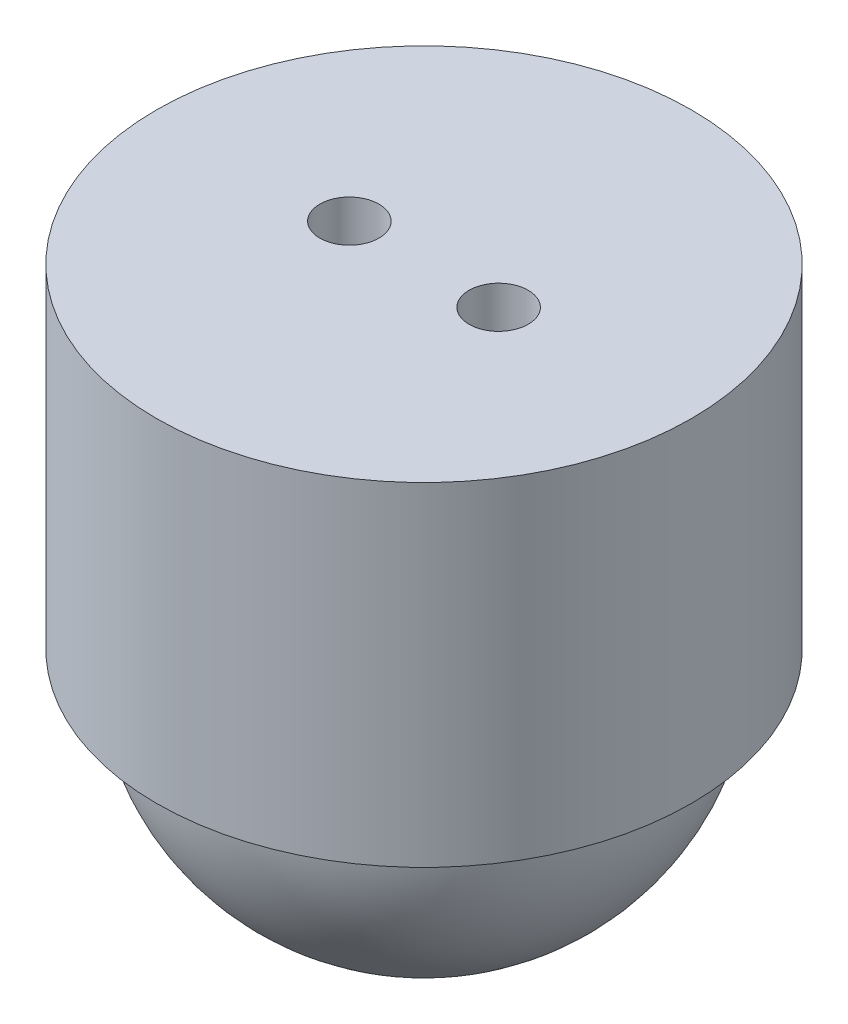
ISO-10303-21;
HEADER;
FILE_DESCRIPTION(('STEP AP214'),'2;1');
FILE_NAME('part.step','',(''),(''),'','','');
FILE_SCHEMA(('AUTOMOTIVE_DESIGN { 1 0 10303 214 1 1 1 1 }'));
ENDSEC;
DATA;
#1=APPLICATION_CONTEXT('core data for automotive mechanical design processes');
#2=APPLICATION_PROTOCOL_DEFINITION('international standard','automotive_design',2000,#1);
#3=PRODUCT_CONTEXT('',#1,'mechanical');
#4=PRODUCT('Part','Part','',(#3));
#5=PRODUCT_RELATED_PRODUCT_CATEGORY('part','',(#4));
#6=PRODUCT_DEFINITION_FORMATION('','',#4);
#7=PRODUCT_DEFINITION_CONTEXT('part definition',#1,'design');
#8=PRODUCT_DEFINITION('design','',#6,#7);
#9=PRODUCT_DEFINITION_SHAPE('','',#8);
#10=(LENGTH_UNIT() NAMED_UNIT(*) SI_UNIT(.MILLI.,.METRE.));
#11=(NAMED_UNIT(*) PLANE_ANGLE_UNIT() SI_UNIT($,.RADIAN.));
#12=(NAMED_UNIT(*) SI_UNIT($,.STERADIAN.) SOLID_ANGLE_UNIT());
#13=UNCERTAINTY_MEASURE_WITH_UNIT(LENGTH_MEASURE(1.E-05),#10,'distance_accuracy_value','');
#14=(GEOMETRIC_REPRESENTATION_CONTEXT(3) GLOBAL_UNCERTAINTY_ASSIGNED_CONTEXT((#13)) GLOBAL_UNIT_ASSIGNED_CONTEXT((#10,
#11,#12)) REPRESENTATION_CONTEXT('',''));
#15=CARTESIAN_POINT('',(0.,0.,0.));
#16=DIRECTION('',(0.,0.,1.));
#17=DIRECTION('',(1.,0.,0.));
#18=AXIS2_PLACEMENT_3D('',#15,#16,#17);
#19=CARTESIAN_POINT('',(0.,0.,0.));
#20=DIRECTION('',(-1.,0.,0.));
#21=DIRECTION('',(0.,1.,0.));
#22=AXIS2_PLACEMENT_3D('',#19,#20,#21);
#23=SPHERICAL_SURFACE('',#22,9.5);
#24=CARTESIAN_POINT('',(0.,0.,0.));
#25=DIRECTION('',(0.,1.,0.));
#26=DIRECTION('',(0.,0.,1.));
#27=AXIS2_PLACEMENT_3D('',#24,#25,#26);
#28=SPHERICAL_SURFACE('',#27,9.5);
#29=CARTESIAN_POINT('',(0.,0.,0.));
#30=DIRECTION('',(0.,1.,0.));
#31=DIRECTION('',(0.,0.,1.));
#32=AXIS2_PLACEMENT_3D('',#29,#30,#31);
#33=CIRCLE('',#32,9.5);
#34=CARTESIAN_POINT('',(0.,0.,9.5));
#35=VERTEX_POINT('',#34);
#36=EDGE_CURVE('E10',#35,#35,#33,.T.);
#37=ORIENTED_EDGE('',*,*,#36,.F.);
#38=EDGE_LOOP('',(#37));
#39=FACE_BOUND('',#38,.T.);
#40=ADVANCED_FACE('F43',(#39),#28,.T.);
#41=CARTESIAN_POINT('',(0.,13.614,0.));
#42=DIRECTION('',(0.,-1.,0.));
#43=DIRECTION('',(0.,0.,-1.));
#44=AXIS2_PLACEMENT_3D('',#41,#42,#43);
#45=CYLINDRICAL_SURFACE('',#44,10.922);
#46=CARTESIAN_POINT('',(0.,13.614,0.));
#47=DIRECTION('',(0.,1.,0.));
#48=DIRECTION('',(0.,0.,1.));
#49=AXIS2_PLACEMENT_3D('',#46,#47,#48);
#50=CIRCLE('',#49,10.922);
#51=CARTESIAN_POINT('',(0.,13.614,10.922));
#52=VERTEX_POINT('',#51);
#53=EDGE_CURVE('E50',#52,#52,#50,.T.);
#54=ORIENTED_EDGE('',*,*,#53,.F.);
#55=EDGE_LOOP('',(#54));
#56=FACE_BOUND('',#55,.T.);
#57=CARTESIAN_POINT('',(0.,0.,0.));
#58=DIRECTION('',(0.,1.,0.));
#59=DIRECTION('',(0.,0.,1.));
#60=AXIS2_PLACEMENT_3D('',#57,#58,#59);
#61=CIRCLE('',#60,10.922);
#62=CARTESIAN_POINT('',(0.,0.,10.922));
#63=VERTEX_POINT('',#62);
#64=EDGE_CURVE('E55',#63,#63,#61,.T.);
#65=ORIENTED_EDGE('',*,*,#64,.T.);
#66=EDGE_LOOP('',(#65));
#67=FACE_BOUND('',#66,.T.);
#68=ADVANCED_FACE('F92',(#56,#67),#45,.T.);
#69=CARTESIAN_POINT('',(0.,13.614,0.));
#70=DIRECTION('',(0.,1.,0.));
#71=DIRECTION('',(0.,0.,1.));
#72=AXIS2_PLACEMENT_3D('',#69,#70,#71);
#73=PLANE('',#72);
#74=CARTESIAN_POINT('',(-3.048,13.614,0.));
#75=DIRECTION('',(0.,1.,0.));
#76=DIRECTION('',(0.,0.,1.));
#77=AXIS2_PLACEMENT_3D('',#74,#75,#76);
#78=CIRCLE('',#77,1.2065);
#79=CARTESIAN_POINT('',(-3.048,13.614,1.2065));
#80=VERTEX_POINT('',#79);
#81=EDGE_CURVE('E71',#80,#80,#78,.T.);
#82=ORIENTED_EDGE('',*,*,#81,.F.);
#83=EDGE_LOOP('',(#82));
#84=FACE_BOUND('',#83,.T.);
#85=CARTESIAN_POINT('',(3.048,13.614,0.));
#86=DIRECTION('',(0.,1.,0.));
#87=DIRECTION('',(0.,0.,-1.));
#88=AXIS2_PLACEMENT_3D('',#85,#86,#87);
#89=CIRCLE('',#88,1.2065);
#90=CARTESIAN_POINT('',(3.048,13.614,-1.2065));
#91=VERTEX_POINT('',#90);
#92=EDGE_CURVE('E67',#91,#91,#89,.T.);
#93=ORIENTED_EDGE('',*,*,#92,.F.);
#94=EDGE_LOOP('',(#93));
#95=FACE_BOUND('',#94,.T.);
#96=ORIENTED_EDGE('',*,*,#53,.T.);
#97=EDGE_LOOP('',(#96));
#98=FACE_BOUND('',#97,.T.);
#99=ADVANCED_FACE('F88',(#84,#95,#98),#73,.T.);
#100=CARTESIAN_POINT('',(0.,0.,0.));
#101=DIRECTION('',(0.,1.,0.));
#102=DIRECTION('',(0.,0.,1.));
#103=AXIS2_PLACEMENT_3D('',#100,#101,#102);
#104=PLANE('',#103);
#105=ORIENTED_EDGE('',*,*,#36,.T.);
#106=EDGE_LOOP('',(#105));
#107=FACE_BOUND('',#106,.T.);
#108=ORIENTED_EDGE('',*,*,#64,.F.);
#109=EDGE_LOOP('',(#108));
#110=FACE_BOUND('',#109,.T.);
#111=ADVANCED_FACE('F91',(#107,#110),#104,.F.);
#112=CARTESIAN_POINT('',(3.048,0.,0.));
#113=DIRECTION('',(0.,1.,0.));
#114=DIRECTION('',(0.,0.,1.));
#115=AXIS2_PLACEMENT_3D('',#112,#113,#114);
#116=CYLINDRICAL_SURFACE('',#115,1.2065);
#117=CARTESIAN_POINT('',(3.048,0.,0.));
#118=DIRECTION('',(0.,1.,0.));
#119=DIRECTION('',(0.,0.,-1.));
#120=AXIS2_PLACEMENT_3D('',#117,#118,#119);
#121=CIRCLE('',#120,1.2065);
#122=CARTESIAN_POINT('',(3.048,0.,-1.2065));
#123=VERTEX_POINT('',#122);
#124=EDGE_CURVE('E63',#123,#123,#121,.T.);
#125=ORIENTED_EDGE('',*,*,#124,.F.);
#126=EDGE_LOOP('',(#125));
#127=FACE_BOUND('',#126,.T.);
#128=ORIENTED_EDGE('',*,*,#92,.T.);
#129=EDGE_LOOP('',(#128));
#130=FACE_BOUND('',#129,.T.);
#131=ADVANCED_FACE('F96',(#127,#130),#116,.F.);
#132=CARTESIAN_POINT('',(3.048,0.,0.));
#133=DIRECTION('',(0.,-1.,0.));
#134=DIRECTION('',(0.,0.,-1.));
#135=AXIS2_PLACEMENT_3D('',#132,#133,#134);
#136=PLANE('',#135);
#137=ORIENTED_EDGE('',*,*,#124,.T.);
#138=EDGE_LOOP('',(#137));
#139=FACE_BOUND('',#138,.T.);
#140=ADVANCED_FACE('F84',(#139),#136,.F.);
#141=CARTESIAN_POINT('',(-3.048,0.,0.));
#142=DIRECTION('',(0.,1.,0.));
#143=DIRECTION('',(0.,0.,1.));
#144=AXIS2_PLACEMENT_3D('',#141,#142,#143);
#145=CYLINDRICAL_SURFACE('',#144,1.2065);
#146=CARTESIAN_POINT('',(-3.048,0.,0.));
#147=DIRECTION('',(0.,1.,0.));
#148=DIRECTION('',(0.,0.,1.));
#149=AXIS2_PLACEMENT_3D('',#146,#147,#148);
#150=CIRCLE('',#149,1.2065);
#151=CARTESIAN_POINT('',(-3.048,0.,1.2065));
#152=VERTEX_POINT('',#151);
#153=EDGE_CURVE('E61',#152,#152,#150,.T.);
#154=ORIENTED_EDGE('',*,*,#153,.F.);
#155=EDGE_LOOP('',(#154));
#156=FACE_BOUND('',#155,.T.);
#157=ORIENTED_EDGE('',*,*,#81,.T.);
#158=EDGE_LOOP('',(#157));
#159=FACE_BOUND('',#158,.T.);
#160=ADVANCED_FACE('F81',(#156,#159),#145,.F.);
#161=CARTESIAN_POINT('',(-3.048,0.,0.));
#162=DIRECTION('',(0.,1.,0.));
#163=DIRECTION('',(0.,0.,1.));
#164=AXIS2_PLACEMENT_3D('',#161,#162,#163);
#165=PLANE('',#164);
#166=ORIENTED_EDGE('',*,*,#153,.T.);
#167=EDGE_LOOP('',(#166));
#168=FACE_BOUND('',#167,.T.);
#169=ADVANCED_FACE('F79',(#168),#165,.T.);
#170=CLOSED_SHELL('',(#40,#68,#99,#111,#131,#140,#160,#169));
#171=MANIFOLD_SOLID_BREP('B2',#170);
#172=ADVANCED_BREP_SHAPE_REPRESENTATION('',(#18,#171),#14);
#173=SHAPE_DEFINITION_REPRESENTATION(#9,#172);
ENDSEC;
END-ISO-10303-21;
